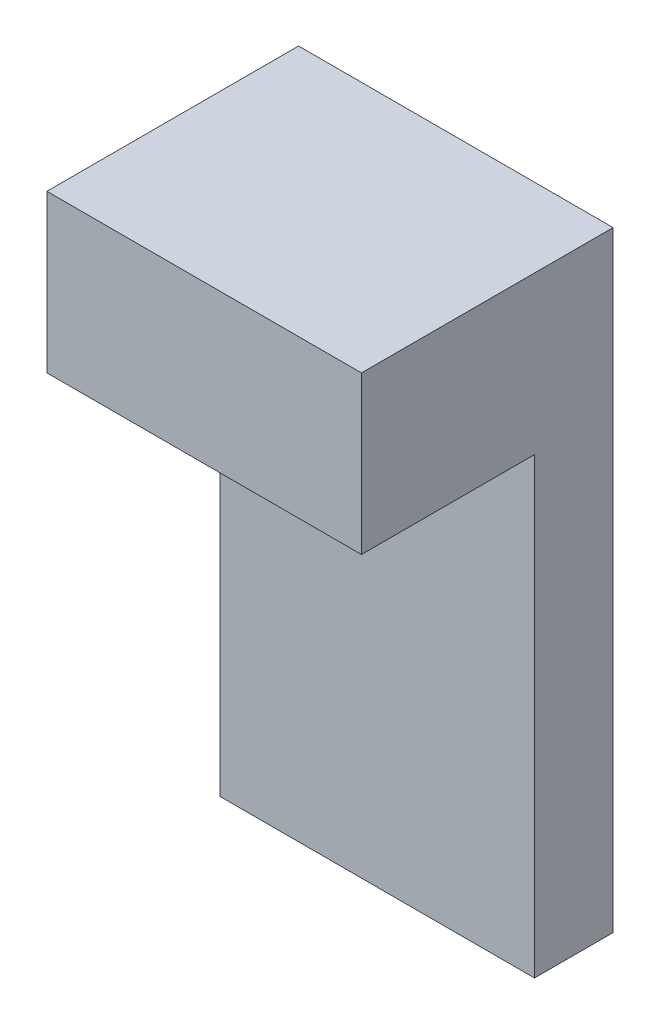
ISO-10303-21;
HEADER;
FILE_DESCRIPTION(('STEP AP214'),'2;1');
FILE_NAME('part.step','',(''),(''),'','','');
FILE_SCHEMA(('AUTOMOTIVE_DESIGN { 1 0 10303 214 1 1 1 1 }'));
ENDSEC;
DATA;
#1=APPLICATION_CONTEXT('core data for automotive mechanical design processes');
#2=APPLICATION_PROTOCOL_DEFINITION('international standard','automotive_design',2000,#1);
#3=PRODUCT_CONTEXT('',#1,'mechanical');
#4=PRODUCT('Part','Part','',(#3));
#5=PRODUCT_RELATED_PRODUCT_CATEGORY('part','',(#4));
#6=PRODUCT_DEFINITION_FORMATION('','',#4);
#7=PRODUCT_DEFINITION_CONTEXT('part definition',#1,'design');
#8=PRODUCT_DEFINITION('design','',#6,#7);
#9=PRODUCT_DEFINITION_SHAPE('','',#8);
#10=(LENGTH_UNIT() NAMED_UNIT(*) SI_UNIT(.MILLI.,.METRE.));
#11=(NAMED_UNIT(*) PLANE_ANGLE_UNIT() SI_UNIT($,.RADIAN.));
#12=(NAMED_UNIT(*) SI_UNIT($,.STERADIAN.) SOLID_ANGLE_UNIT());
#13=UNCERTAINTY_MEASURE_WITH_UNIT(LENGTH_MEASURE(1.E-05),#10,'distance_accuracy_value','');
#14=(GEOMETRIC_REPRESENTATION_CONTEXT(3) GLOBAL_UNCERTAINTY_ASSIGNED_CONTEXT((#13)) GLOBAL_UNIT_ASSIGNED_CONTEXT((#10,
#11,#12)) REPRESENTATION_CONTEXT('',''));
#15=CARTESIAN_POINT('',(0.,0.,0.));
#16=DIRECTION('',(0.,0.,1.));
#17=DIRECTION('',(1.,0.,0.));
#18=AXIS2_PLACEMENT_3D('',#15,#16,#17);
#19=CARTESIAN_POINT('',(-2.91915446042015,31.9405536474541,6.35));
#20=DIRECTION('',(-1.,0.,0.));
#21=DIRECTION('',(0.,-1.,0.));
#22=AXIS2_PLACEMENT_3D('',#19,#20,#21);
#23=PLANE('',#22);
#24=DIRECTION('',(0.,1.,0.));
#25=VECTOR('',#24,1.);
#26=CARTESIAN_POINT('',(-2.91915446042015,31.9405536474541,0.));
#27=LINE('',#26,#25);
#28=CARTESIAN_POINT('',(-2.91915446042015,-17.3594463645459,0.));
#29=VERTEX_POINT('',#28);
#30=CARTESIAN_POINT('',(-2.91915446042015,31.9405536474541,0.));
#31=VERTEX_POINT('',#30);
#32=EDGE_CURVE('E133',#29,#31,#27,.T.);
#33=ORIENTED_EDGE('',*,*,#32,.T.);
#34=DIRECTION('',(0.,0.,-1.));
#35=VECTOR('',#34,1.);
#36=CARTESIAN_POINT('',(-2.91915446042015,31.9405536474541,6.35));
#37=LINE('',#36,#35);
#38=CARTESIAN_POINT('',(-2.91915446042015,31.9405536474541,20.32));
#39=VERTEX_POINT('',#38);
#40=EDGE_CURVE('E11',#39,#31,#37,.T.);
#41=ORIENTED_EDGE('',*,*,#40,.F.);
#42=DIRECTION('',(0.,1.,0.));
#43=VECTOR('',#42,1.);
#44=CARTESIAN_POINT('',(-2.91915446042015,19.2405536474541,20.32));
#45=LINE('',#44,#43);
#46=CARTESIAN_POINT('',(-2.91915446042015,19.2405536474541,20.32));
#47=VERTEX_POINT('',#46);
#48=EDGE_CURVE('E109',#47,#39,#45,.T.);
#49=ORIENTED_EDGE('',*,*,#48,.F.);
#50=DIRECTION('',(0.,0.,-1.));
#51=VECTOR('',#50,1.);
#52=CARTESIAN_POINT('',(-2.91915446042015,19.2405536474541,20.32));
#53=LINE('',#52,#51);
#54=CARTESIAN_POINT('',(-2.91915446042015,19.2405536474541,6.35));
#55=VERTEX_POINT('',#54);
#56=EDGE_CURVE('E105',#47,#55,#53,.T.);
#57=ORIENTED_EDGE('',*,*,#56,.T.);
#58=DIRECTION('',(0.,1.,0.));
#59=VECTOR('',#58,1.);
#60=CARTESIAN_POINT('',(-2.91915446042015,31.9405536474541,6.35));
#61=LINE('',#60,#59);
#62=CARTESIAN_POINT('',(-2.91915446042015,-17.3594463645459,6.35));
#63=VERTEX_POINT('',#62);
#64=EDGE_CURVE('E134',#63,#55,#61,.T.);
#65=ORIENTED_EDGE('',*,*,#64,.F.);
#66=DIRECTION('',(0.,0.,-1.));
#67=VECTOR('',#66,1.);
#68=CARTESIAN_POINT('',(-2.91915446042015,-17.3594463645459,6.35));
#69=LINE('',#68,#67);
#70=EDGE_CURVE('E46',#63,#29,#69,.T.);
#71=ORIENTED_EDGE('',*,*,#70,.T.);
#72=EDGE_LOOP('',(#33,#41,#49,#57,#65,#71));
#73=FACE_BOUND('',#72,.T.);
#74=ADVANCED_FACE('F39',(#73),#23,.F.);
#75=CARTESIAN_POINT('',(-15.6191544604202,31.9405536474541,6.35));
#76=DIRECTION('',(0.,-1.,0.));
#77=DIRECTION('',(0.,0.,-1.));
#78=AXIS2_PLACEMENT_3D('',#75,#76,#77);
#79=PLANE('',#78);
#80=DIRECTION('',(-1.,0.,0.));
#81=VECTOR('',#80,1.);
#82=CARTESIAN_POINT('',(-15.6191544604202,31.9405536474541,0.));
#83=LINE('',#82,#81);
#84=CARTESIAN_POINT('',(-28.3191544604202,31.9405536474541,0.));
#85=VERTEX_POINT('',#84);
#86=EDGE_CURVE('E72',#31,#85,#83,.T.);
#87=ORIENTED_EDGE('',*,*,#86,.T.);
#88=DIRECTION('',(0.,0.,-1.));
#89=VECTOR('',#88,1.);
#90=CARTESIAN_POINT('',(-28.3191544604202,31.9405536474541,6.35));
#91=LINE('',#90,#89);
#92=CARTESIAN_POINT('',(-28.3191544604201,31.9405536474541,20.32));
#93=VERTEX_POINT('',#92);
#94=EDGE_CURVE('E123',#93,#85,#91,.T.);
#95=ORIENTED_EDGE('',*,*,#94,.F.);
#96=DIRECTION('',(-1.,0.,0.));
#97=VECTOR('',#96,1.);
#98=CARTESIAN_POINT('',(-2.91915446042015,31.9405536474541,20.32));
#99=LINE('',#98,#97);
#100=EDGE_CURVE('E116',#39,#93,#99,.T.);
#101=ORIENTED_EDGE('',*,*,#100,.F.);
#102=ORIENTED_EDGE('',*,*,#40,.T.);
#103=EDGE_LOOP('',(#87,#95,#101,#102));
#104=FACE_BOUND('',#103,.T.);
#105=ADVANCED_FACE('F157',(#104),#79,.F.);
#106=CARTESIAN_POINT('',(-15.6191544604201,-17.3594463645459,6.35));
#107=DIRECTION('',(0.,1.,0.));
#108=DIRECTION('',(0.,0.,1.));
#109=AXIS2_PLACEMENT_3D('',#106,#107,#108);
#110=PLANE('',#109);
#111=DIRECTION('',(1.,0.,0.));
#112=VECTOR('',#111,1.);
#113=CARTESIAN_POINT('',(-15.6191544604201,-17.3594463645459,0.));
#114=LINE('',#113,#112);
#115=CARTESIAN_POINT('',(-28.3191544604201,-17.3594463645459,0.));
#116=VERTEX_POINT('',#115);
#117=EDGE_CURVE('E79',#116,#29,#114,.T.);
#118=ORIENTED_EDGE('',*,*,#117,.T.);
#119=ORIENTED_EDGE('',*,*,#70,.F.);
#120=DIRECTION('',(1.,0.,0.));
#121=VECTOR('',#120,1.);
#122=CARTESIAN_POINT('',(-15.6191544604201,-17.3594463645459,6.35));
#123=LINE('',#122,#121);
#124=CARTESIAN_POINT('',(-28.3191544604201,-17.3594463645459,6.35));
#125=VERTEX_POINT('',#124);
#126=EDGE_CURVE('E59',#125,#63,#123,.T.);
#127=ORIENTED_EDGE('',*,*,#126,.F.);
#128=DIRECTION('',(0.,0.,1.));
#129=VECTOR('',#128,1.);
#130=CARTESIAN_POINT('',(-28.3191544604201,-17.3594463645459,6.35));
#131=LINE('',#130,#129);
#132=EDGE_CURVE('E131',#116,#125,#131,.T.);
#133=ORIENTED_EDGE('',*,*,#132,.F.);
#134=EDGE_LOOP('',(#118,#119,#127,#133));
#135=FACE_BOUND('',#134,.T.);
#136=ADVANCED_FACE('F154',(#135),#110,.F.);
#137=CARTESIAN_POINT('',(0.,0.,6.35));
#138=DIRECTION('',(0.,0.,1.));
#139=DIRECTION('',(1.,0.,0.));
#140=AXIS2_PLACEMENT_3D('',#137,#138,#139);
#141=PLANE('',#140);
#142=DIRECTION('',(1.,0.,0.));
#143=VECTOR('',#142,1.);
#144=CARTESIAN_POINT('',(-2.91915446042015,19.2405536474541,6.35));
#145=LINE('',#144,#143);
#146=CARTESIAN_POINT('',(-28.3191544604201,19.2405536474541,6.35));
#147=VERTEX_POINT('',#146);
#148=EDGE_CURVE('E53',#147,#55,#145,.T.);
#149=ORIENTED_EDGE('',*,*,#148,.F.);
#150=DIRECTION('',(0.,1.,0.));
#151=VECTOR('',#150,1.);
#152=CARTESIAN_POINT('',(-28.3191544604201,-17.3594463645459,6.35));
#153=LINE('',#152,#151);
#154=EDGE_CURVE('E121',#125,#147,#153,.T.);
#155=ORIENTED_EDGE('',*,*,#154,.F.);
#156=ORIENTED_EDGE('',*,*,#126,.T.);
#157=ORIENTED_EDGE('',*,*,#64,.T.);
#158=EDGE_LOOP('',(#149,#155,#156,#157));
#159=FACE_BOUND('',#158,.T.);
#160=ADVANCED_FACE('F145',(#159),#141,.T.);
#161=CARTESIAN_POINT('',(0.,0.,0.));
#162=DIRECTION('',(0.,0.,1.));
#163=DIRECTION('',(1.,0.,0.));
#164=AXIS2_PLACEMENT_3D('',#161,#162,#163);
#165=PLANE('',#164);
#166=ORIENTED_EDGE('',*,*,#32,.F.);
#167=ORIENTED_EDGE('',*,*,#117,.F.);
#168=DIRECTION('',(0.,-1.,0.));
#169=VECTOR('',#168,1.);
#170=CARTESIAN_POINT('',(-28.3191544604201,-17.3594463645459,0.));
#171=LINE('',#170,#169);
#172=EDGE_CURVE('E129',#85,#116,#171,.T.);
#173=ORIENTED_EDGE('',*,*,#172,.F.);
#174=ORIENTED_EDGE('',*,*,#86,.F.);
#175=EDGE_LOOP('',(#166,#167,#173,#174));
#176=FACE_BOUND('',#175,.T.);
#177=ADVANCED_FACE('F143',(#176),#165,.F.);
#178=CARTESIAN_POINT('',(-28.3191544604201,0.,0.));
#179=DIRECTION('',(-1.,0.,0.));
#180=DIRECTION('',(0.,-1.,0.));
#181=AXIS2_PLACEMENT_3D('',#178,#179,#180);
#182=PLANE('',#181);
#183=ORIENTED_EDGE('',*,*,#154,.T.);
#184=DIRECTION('',(0.,0.,-1.));
#185=VECTOR('',#184,1.);
#186=CARTESIAN_POINT('',(-28.3191544604201,19.2405536474541,20.32));
#187=LINE('',#186,#185);
#188=CARTESIAN_POINT('',(-28.3191544604201,19.2405536474541,20.32));
#189=VERTEX_POINT('',#188);
#190=EDGE_CURVE('E103',#189,#147,#187,.T.);
#191=ORIENTED_EDGE('',*,*,#190,.F.);
#192=DIRECTION('',(0.,-1.,0.));
#193=VECTOR('',#192,1.);
#194=CARTESIAN_POINT('',(-28.3191544604201,19.2405536474541,20.32));
#195=LINE('',#194,#193);
#196=EDGE_CURVE('E110',#93,#189,#195,.T.);
#197=ORIENTED_EDGE('',*,*,#196,.F.);
#198=ORIENTED_EDGE('',*,*,#94,.T.);
#199=ORIENTED_EDGE('',*,*,#172,.T.);
#200=ORIENTED_EDGE('',*,*,#132,.T.);
#201=EDGE_LOOP('',(#183,#191,#197,#198,#199,#200));
#202=FACE_BOUND('',#201,.T.);
#203=ADVANCED_FACE('F120',(#202),#182,.T.);
#204=CARTESIAN_POINT('',(-2.91915446042015,19.2405536474541,20.32));
#205=DIRECTION('',(0.,1.,0.));
#206=DIRECTION('',(-1.,0.,0.));
#207=AXIS2_PLACEMENT_3D('',#204,#205,#206);
#208=PLANE('',#207);
#209=ORIENTED_EDGE('',*,*,#148,.T.);
#210=ORIENTED_EDGE('',*,*,#56,.F.);
#211=DIRECTION('',(1.,0.,0.));
#212=VECTOR('',#211,1.);
#213=CARTESIAN_POINT('',(-2.91915446042015,19.2405536474541,20.32));
#214=LINE('',#213,#212);
#215=EDGE_CURVE('E99',#189,#47,#214,.T.);
#216=ORIENTED_EDGE('',*,*,#215,.F.);
#217=ORIENTED_EDGE('',*,*,#190,.T.);
#218=EDGE_LOOP('',(#209,#210,#216,#217));
#219=FACE_BOUND('',#218,.T.);
#220=ADVANCED_FACE('F101',(#219),#208,.F.);
#221=CARTESIAN_POINT('',(0.,0.,20.32));
#222=DIRECTION('',(0.,0.,1.));
#223=DIRECTION('',(1.,0.,0.));
#224=AXIS2_PLACEMENT_3D('',#221,#222,#223);
#225=PLANE('',#224);
#226=ORIENTED_EDGE('',*,*,#196,.T.);
#227=ORIENTED_EDGE('',*,*,#215,.T.);
#228=ORIENTED_EDGE('',*,*,#48,.T.);
#229=ORIENTED_EDGE('',*,*,#100,.T.);
#230=EDGE_LOOP('',(#226,#227,#228,#229));
#231=FACE_BOUND('',#230,.T.);
#232=ADVANCED_FACE('F114',(#231),#225,.T.);
#233=CLOSED_SHELL('',(#74,#105,#136,#160,#177,#203,#220,#232));
#234=MANIFOLD_SOLID_BREP('B2',#233);
#235=ADVANCED_BREP_SHAPE_REPRESENTATION('',(#18,#234),#14);
#236=SHAPE_DEFINITION_REPRESENTATION(#9,#235);
ENDSEC;
END-ISO-10303-21;
